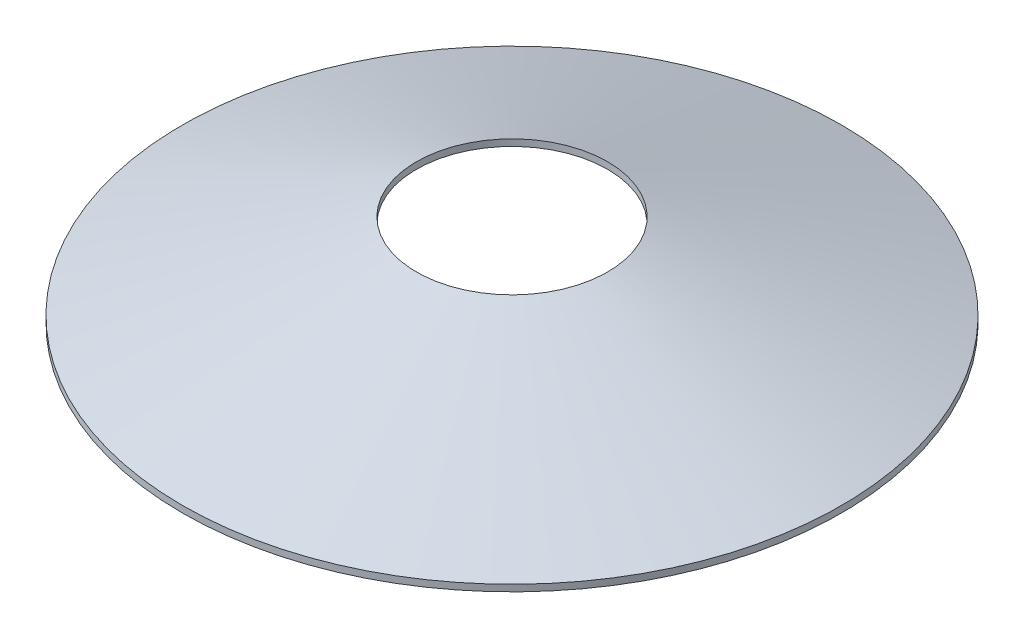
ISO-10303-21;
HEADER;
FILE_DESCRIPTION(('STEP AP214'),'2;1');
FILE_NAME('part.step','',(''),(''),'','','');
FILE_SCHEMA(('AUTOMOTIVE_DESIGN { 1 0 10303 214 1 1 1 1 }'));
ENDSEC;
DATA;
#1=APPLICATION_CONTEXT('core data for automotive mechanical design processes');
#2=APPLICATION_PROTOCOL_DEFINITION('international standard','automotive_design',2000,#1);
#3=PRODUCT_CONTEXT('',#1,'mechanical');
#4=PRODUCT('Part','Part','',(#3));
#5=PRODUCT_RELATED_PRODUCT_CATEGORY('part','',(#4));
#6=PRODUCT_DEFINITION_FORMATION('','',#4);
#7=PRODUCT_DEFINITION_CONTEXT('part definition',#1,'design');
#8=PRODUCT_DEFINITION('design','',#6,#7);
#9=PRODUCT_DEFINITION_SHAPE('','',#8);
#10=(LENGTH_UNIT() NAMED_UNIT(*) SI_UNIT(.MILLI.,.METRE.));
#11=(NAMED_UNIT(*) PLANE_ANGLE_UNIT() SI_UNIT($,.RADIAN.));
#12=(NAMED_UNIT(*) SI_UNIT($,.STERADIAN.) SOLID_ANGLE_UNIT());
#13=UNCERTAINTY_MEASURE_WITH_UNIT(LENGTH_MEASURE(1.E-05),#10,'distance_accuracy_value','');
#14=(GEOMETRIC_REPRESENTATION_CONTEXT(3) GLOBAL_UNCERTAINTY_ASSIGNED_CONTEXT((#13)) GLOBAL_UNIT_ASSIGNED_CONTEXT((#10,
#11,#12)) REPRESENTATION_CONTEXT('',''));
#15=CARTESIAN_POINT('',(0.,0.,0.));
#16=DIRECTION('',(0.,0.,1.));
#17=DIRECTION('',(1.,0.,0.));
#18=AXIS2_PLACEMENT_3D('',#15,#16,#17);
#19=CARTESIAN_POINT('',(0.,0.,0.));
#20=DIRECTION('',(0.,-1.,0.));
#21=DIRECTION('',(0.,0.,-1.));
#22=AXIS2_PLACEMENT_3D('',#19,#20,#21);
#23=CONICAL_SURFACE('',#22,17.5756774163615,1.22173047639603);
#24=CARTESIAN_POINT('',(0.,-4.15811336709957,0.));
#25=DIRECTION('',(0.,-1.,0.));
#26=DIRECTION('',(0.,0.,-1.));
#27=AXIS2_PLACEMENT_3D('',#24,#25,#26);
#28=CIRCLE('',#27,29.);
#29=CARTESIAN_POINT('',(0.,-4.15811336709956,-29.));
#30=VERTEX_POINT('',#29);
#31=EDGE_CURVE('E54',#30,#30,#28,.T.);
#32=CARTESIAN_POINT('',(0.,-30.,0.));
#33=DIRECTION('',(0.,-1.,0.));
#34=DIRECTION('',(0.,0.,-1.));
#35=AXIS2_PLACEMENT_3D('',#32,#33,#34);
#36=CIRCLE('',#35,100.);
#37=CARTESIAN_POINT('',(0.,-30.,-100.));
#38=VERTEX_POINT('',#37);
#39=EDGE_CURVE('E10',#38,#38,#36,.T.);
#40=CARTESIAN_POINT('',(0.,-4.15811336709956,-29.));
#41=CARTESIAN_POINT('',(0.,-4.42729968619228,-29.7395833333333));
#42=CARTESIAN_POINT('',(0.,-4.69648600528499,-30.4791666666667));
#43=CARTESIAN_POINT('',(0.,-5.23485864347042,-31.9583333333333));
#44=CARTESIAN_POINT('',(0.,-5.50404496256313,-32.6979166666667));
#45=CARTESIAN_POINT('',(0.,-6.04241760074855,-34.1770833333333));
#46=CARTESIAN_POINT('',(0.,-6.31160391984127,-34.9166666666667));
#47=CARTESIAN_POINT('',(0.,-6.84997655802669,-36.3958333333333));
#48=CARTESIAN_POINT('',(0.,-7.11916287711941,-37.1354166666667));
#49=CARTESIAN_POINT('',(0.,-7.65753551530483,-38.6145833333333));
#50=CARTESIAN_POINT('',(0.,-7.92672183439754,-39.3541666666667));
#51=CARTESIAN_POINT('',(0.,-8.46509447258297,-40.8333333333333));
#52=CARTESIAN_POINT('',(0.,-8.73428079167568,-41.5729166666667));
#53=CARTESIAN_POINT('',(0.,-9.27265342986111,-43.0520833333333));
#54=CARTESIAN_POINT('',(0.,-9.54183974895382,-43.7916666666667));
#55=CARTESIAN_POINT('',(0.,-10.0802123871392,-45.2708333333333));
#56=CARTESIAN_POINT('',(0.,-10.349398706232,-46.0104166666667));
#57=CARTESIAN_POINT('',(0.,-10.8877713444174,-47.4895833333333));
#58=CARTESIAN_POINT('',(0.,-11.1569576635101,-48.2291666666667));
#59=CARTESIAN_POINT('',(0.,-11.6953303016955,-49.7083333333333));
#60=CARTESIAN_POINT('',(0.,-11.9645166207882,-50.4479166666667));
#61=CARTESIAN_POINT('',(0.,-12.5028892589737,-51.9270833333333));
#62=CARTESIAN_POINT('',(0.,-12.7720755780664,-52.6666666666667));
#63=CARTESIAN_POINT('',(0.,-13.3104482162518,-54.1458333333333));
#64=CARTESIAN_POINT('',(0.,-13.5796345353445,-54.8854166666667));
#65=CARTESIAN_POINT('',(0.,-14.1180071735299,-56.3645833333333));
#66=CARTESIAN_POINT('',(0.,-14.3871934926227,-57.1041666666667));
#67=CARTESIAN_POINT('',(0.,-14.9255661308081,-58.5833333333333));
#68=CARTESIAN_POINT('',(0.,-15.1947524499008,-59.3229166666667));
#69=CARTESIAN_POINT('',(0.,-15.7331250880862,-60.8020833333333));
#70=CARTESIAN_POINT('',(0.,-16.0023114071789,-61.5416666666667));
#71=CARTESIAN_POINT('',(0.,-16.5406840453644,-63.0208333333333));
#72=CARTESIAN_POINT('',(0.,-16.8098703644571,-63.7604166666667));
#73=CARTESIAN_POINT('',(0.,-17.3482430026425,-65.2395833333333));
#74=CARTESIAN_POINT('',(0.,-17.6174293217352,-65.9791666666667));
#75=CARTESIAN_POINT('',(0.,-18.1558019599206,-67.4583333333333));
#76=CARTESIAN_POINT('',(0.,-18.4249882790133,-68.1979166666666));
#77=CARTESIAN_POINT('',(0.,-18.9633609171988,-69.6770833333333));
#78=CARTESIAN_POINT('',(0.,-19.2325472362915,-70.4166666666667));
#79=CARTESIAN_POINT('',(0.,-19.7709198744769,-71.8958333333333));
#80=CARTESIAN_POINT('',(0.,-20.0401061935696,-72.6354166666667));
#81=CARTESIAN_POINT('',(0.,-20.578478831755,-74.1145833333333));
#82=CARTESIAN_POINT('',(0.,-20.8476651508478,-74.8541666666667));
#83=CARTESIAN_POINT('',(0.,-21.3860377890332,-76.3333333333333));
#84=CARTESIAN_POINT('',(0.,-21.6552241081259,-77.0729166666667));
#85=CARTESIAN_POINT('',(0.,-22.1935967463113,-78.5520833333333));
#86=CARTESIAN_POINT('',(0.,-22.462783065404,-79.2916666666667));
#87=CARTESIAN_POINT('',(0.,-23.0011557035895,-80.7708333333333));
#88=CARTESIAN_POINT('',(0.,-23.2703420226822,-81.5104166666667));
#89=CARTESIAN_POINT('',(0.,-23.8087146608676,-82.9895833333333));
#90=CARTESIAN_POINT('',(0.,-24.0779009799603,-83.7291666666667));
#91=CARTESIAN_POINT('',(0.,-24.6162736181457,-85.2083333333333));
#92=CARTESIAN_POINT('',(0.,-24.8854599372384,-85.9479166666667));
#93=CARTESIAN_POINT('',(0.,-25.4238325754239,-87.4270833333333));
#94=CARTESIAN_POINT('',(0.,-25.6930188945166,-88.1666666666667));
#95=CARTESIAN_POINT('',(0.,-26.231391532702,-89.6458333333333));
#96=CARTESIAN_POINT('',(0.,-26.5005778517947,-90.3854166666667));
#97=CARTESIAN_POINT('',(0.,-27.0389504899802,-91.8645833333333));
#98=CARTESIAN_POINT('',(0.,-27.3081368090729,-92.6041666666667));
#99=CARTESIAN_POINT('',(0.,-27.8465094472583,-94.0833333333333));
#100=CARTESIAN_POINT('',(0.,-28.115695766351,-94.8229166666667));
#101=CARTESIAN_POINT('',(0.,-28.6540684045364,-96.3020833333333));
#102=CARTESIAN_POINT('',(0.,-28.9232547236291,-97.0416666666667));
#103=CARTESIAN_POINT('',(0.,-29.4616273618146,-98.5208333333333));
#104=CARTESIAN_POINT('',(0.,-29.7308136809073,-99.2604166666667));
#105=CARTESIAN_POINT('',(0.,-30.,-100.));
#106=B_SPLINE_CURVE_WITH_KNOTS('',3,(#40,#41,#42,#43,#44,#45,#46,#47,#48,#49,#50,#51,#52,#53,
#54,#55,#56,#57,#58,#59,#60,#61,#62,#63,#64,#65,#66,#67,#68,#69,#70,#71,#72,#73,#74,#75,#76,#77,
#78,#79,#80,#81,#82,#83,#84,#85,#86,#87,#88,#89,#90,#91,#92,#93,#94,#95,#96,#97,#98,#99,#100,
#101,#102,#103,#104,#105),.UNSPECIFIED.,.F.,.F.,(4,2,2,2,2,2,2,2,2,2,2,2,2,2,2,2,2,2,2,2,2,2,2,
2,2,2,2,2,2,2,2,2,4),(0.,2.36114443268093,4.72228886536186,7.0834332980428,9.44457773072372,
11.8057221634047,14.1668665960856,16.5280110287665,18.8891554614474,21.2502998941284,
23.6114443268093,25.9725887594902,28.3337331921712,30.6948776248521,33.056022057533,
35.4171664902139,37.7783109228949,40.1394553555758,42.5005997882567,44.8617442209377,
47.2228886536186,49.5840330862995,51.9451775189805,54.3063219516614,56.6674663843423,
59.0286108170233,61.3897552497042,63.7508996823851,66.1120441150661,68.473188547747,
70.8343329804279,73.1954774131089,75.5566218457898),.UNSPECIFIED.);
#107=EDGE_CURVE('BSEAM41',#30,#38,#106,.T.);
#108=ORIENTED_EDGE('',*,*,#31,.T.);
#109=ORIENTED_EDGE('',*,*,#39,.F.);
#110=ORIENTED_EDGE('',*,*,#107,.T.);
#111=ORIENTED_EDGE('',*,*,#107,.F.);
#112=EDGE_LOOP('',(#108,#110,#109,#111));
#113=FACE_BOUND('',#112,.T.);
#114=ADVANCED_FACE('F41',(#113),#23,.T.);
#115=CARTESIAN_POINT('',(0.,-2.,0.));
#116=DIRECTION('',(0.,-1.,0.));
#117=DIRECTION('',(0.,0.,-1.));
#118=AXIS2_PLACEMENT_3D('',#115,#116,#117);
#119=CYLINDRICAL_SURFACE('',#118,100.);
#120=CARTESIAN_POINT('',(0.,-32.,0.));
#121=DIRECTION('',(0.,-1.,0.));
#122=DIRECTION('',(0.,0.,-1.));
#123=AXIS2_PLACEMENT_3D('',#120,#121,#122);
#124=CIRCLE('',#123,100.);
#125=CARTESIAN_POINT('',(0.,-32.,-100.));
#126=VERTEX_POINT('',#125);
#127=EDGE_CURVE('E49',#126,#126,#124,.T.);
#128=ORIENTED_EDGE('',*,*,#127,.F.);
#129=EDGE_LOOP('',(#128));
#130=FACE_BOUND('',#129,.T.);
#131=ORIENTED_EDGE('',*,*,#39,.T.);
#132=EDGE_LOOP('',(#131));
#133=FACE_BOUND('',#132,.T.);
#134=ADVANCED_FACE('F75',(#130,#133),#119,.T.);
#135=CARTESIAN_POINT('',(0.,-32.,0.));
#136=DIRECTION('',(0.,-1.,0.));
#137=DIRECTION('',(0.,0.,-1.));
#138=AXIS2_PLACEMENT_3D('',#135,#136,#137);
#139=CONICAL_SURFACE('',#138,100.,1.22173047639603);
#140=CARTESIAN_POINT('',(0.,-6.15811336709958,0.));
#141=DIRECTION('',(0.,-1.,0.));
#142=DIRECTION('',(0.,0.,-1.));
#143=AXIS2_PLACEMENT_3D('',#140,#141,#142);
#144=CIRCLE('',#143,29.);
#145=CARTESIAN_POINT('',(0.,-6.15811336709958,-29.));
#146=VERTEX_POINT('',#145);
#147=EDGE_CURVE('E44',#146,#146,#144,.F.);
#148=CARTESIAN_POINT('',(0.,-6.15811336709958,-29.));
#149=CARTESIAN_POINT('',(0.,-6.42729968619229,-29.7395833333333));
#150=CARTESIAN_POINT('',(0.,-6.696486005285,-30.4791666666667));
#151=CARTESIAN_POINT('',(0.,-7.23485864347043,-31.9583333333333));
#152=CARTESIAN_POINT('',(0.,-7.50404496256314,-32.6979166666667));
#153=CARTESIAN_POINT('',(0.,-8.04241760074857,-34.1770833333333));
#154=CARTESIAN_POINT('',(0.,-8.31160391984128,-34.9166666666667));
#155=CARTESIAN_POINT('',(0.,-8.84997655802671,-36.3958333333333));
#156=CARTESIAN_POINT('',(0.,-9.11916287711942,-37.1354166666667));
#157=CARTESIAN_POINT('',(0.,-9.65753551530485,-38.6145833333333));
#158=CARTESIAN_POINT('',(0.,-9.92672183439756,-39.3541666666667));
#159=CARTESIAN_POINT('',(0.,-10.465094472583,-40.8333333333333));
#160=CARTESIAN_POINT('',(0.,-10.7342807916757,-41.5729166666667));
#161=CARTESIAN_POINT('',(0.,-11.2726534298611,-43.0520833333333));
#162=CARTESIAN_POINT('',(0.,-11.5418397489538,-43.7916666666667));
#163=CARTESIAN_POINT('',(0.,-12.0802123871393,-45.2708333333333));
#164=CARTESIAN_POINT('',(0.,-12.349398706232,-46.0104166666667));
#165=CARTESIAN_POINT('',(0.,-12.8877713444174,-47.4895833333333));
#166=CARTESIAN_POINT('',(0.,-13.1569576635101,-48.2291666666667));
#167=CARTESIAN_POINT('',(0.,-13.6953303016955,-49.7083333333333));
#168=CARTESIAN_POINT('',(0.,-13.9645166207883,-50.4479166666667));
#169=CARTESIAN_POINT('',(0.,-14.5028892589737,-51.9270833333333));
#170=CARTESIAN_POINT('',(0.,-14.7720755780664,-52.6666666666667));
#171=CARTESIAN_POINT('',(0.,-15.3104482162518,-54.1458333333333));
#172=CARTESIAN_POINT('',(0.,-15.5796345353445,-54.8854166666667));
#173=CARTESIAN_POINT('',(0.,-16.11800717353,-56.3645833333333));
#174=CARTESIAN_POINT('',(0.,-16.3871934926227,-57.1041666666667));
#175=CARTESIAN_POINT('',(0.,-16.9255661308081,-58.5833333333333));
#176=CARTESIAN_POINT('',(0.,-17.1947524499008,-59.3229166666667));
#177=CARTESIAN_POINT('',(0.,-17.7331250880862,-60.8020833333333));
#178=CARTESIAN_POINT('',(0.,-18.0023114071789,-61.5416666666667));
#179=CARTESIAN_POINT('',(0.,-18.5406840453644,-63.0208333333333));
#180=CARTESIAN_POINT('',(0.,-18.8098703644571,-63.7604166666667));
#181=CARTESIAN_POINT('',(0.,-19.3482430026425,-65.2395833333333));
#182=CARTESIAN_POINT('',(0.,-19.6174293217352,-65.9791666666667));
#183=CARTESIAN_POINT('',(0.,-20.1558019599206,-67.4583333333333));
#184=CARTESIAN_POINT('',(0.,-20.4249882790134,-68.1979166666666));
#185=CARTESIAN_POINT('',(0.,-20.9633609171988,-69.6770833333333));
#186=CARTESIAN_POINT('',(0.,-21.2325472362915,-70.4166666666667));
#187=CARTESIAN_POINT('',(0.,-21.7709198744769,-71.8958333333333));
#188=CARTESIAN_POINT('',(0.,-22.0401061935696,-72.6354166666667));
#189=CARTESIAN_POINT('',(0.,-22.5784788317551,-74.1145833333333));
#190=CARTESIAN_POINT('',(0.,-22.8476651508478,-74.8541666666667));
#191=CARTESIAN_POINT('',(0.,-23.3860377890332,-76.3333333333333));
#192=CARTESIAN_POINT('',(0.,-23.6552241081259,-77.0729166666667));
#193=CARTESIAN_POINT('',(0.,-24.1935967463113,-78.5520833333333));
#194=CARTESIAN_POINT('',(0.,-24.4627830654041,-79.2916666666667));
#195=CARTESIAN_POINT('',(0.,-25.0011557035895,-80.7708333333333));
#196=CARTESIAN_POINT('',(0.,-25.2703420226822,-81.5104166666667));
#197=CARTESIAN_POINT('',(0.,-25.8087146608676,-82.9895833333333));
#198=CARTESIAN_POINT('',(0.,-26.0779009799603,-83.7291666666667));
#199=CARTESIAN_POINT('',(0.,-26.6162736181458,-85.2083333333333));
#200=CARTESIAN_POINT('',(0.,-26.8854599372385,-85.9479166666667));
#201=CARTESIAN_POINT('',(0.,-27.4238325754239,-87.4270833333333));
#202=CARTESIAN_POINT('',(0.,-27.6930188945166,-88.1666666666667));
#203=CARTESIAN_POINT('',(0.,-28.231391532702,-89.6458333333333));
#204=CARTESIAN_POINT('',(0.,-28.5005778517947,-90.3854166666667));
#205=CARTESIAN_POINT('',(0.,-29.0389504899802,-91.8645833333333));
#206=CARTESIAN_POINT('',(0.,-29.3081368090729,-92.6041666666667));
#207=CARTESIAN_POINT('',(0.,-29.8465094472583,-94.0833333333333));
#208=CARTESIAN_POINT('',(0.,-30.115695766351,-94.8229166666667));
#209=CARTESIAN_POINT('',(0.,-30.6540684045364,-96.3020833333333));
#210=CARTESIAN_POINT('',(0.,-30.9232547236292,-97.0416666666667));
#211=CARTESIAN_POINT('',(0.,-31.4616273618146,-98.5208333333333));
#212=CARTESIAN_POINT('',(0.,-31.7308136809073,-99.2604166666667));
#213=CARTESIAN_POINT('',(0.,-32.,-100.));
#214=B_SPLINE_CURVE_WITH_KNOTS('',3,(#148,#149,#150,#151,#152,#153,#154,#155,#156,#157,#158,
#159,#160,#161,#162,#163,#164,#165,#166,#167,#168,#169,#170,#171,#172,#173,#174,#175,#176,#177,
#178,#179,#180,#181,#182,#183,#184,#185,#186,#187,#188,#189,#190,#191,#192,#193,#194,#195,#196,
#197,#198,#199,#200,#201,#202,#203,#204,#205,#206,#207,#208,#209,#210,#211,#212,#213),
.UNSPECIFIED.,.F.,.F.,(4,2,2,2,2,2,2,2,2,2,2,2,2,2,2,2,2,2,2,2,2,2,2,2,2,2,2,2,2,2,2,2,4),(0.,
2.36114443268094,4.72228886536186,7.08343329804279,9.44457773072373,11.8057221634047,
14.1668665960856,16.5280110287665,18.8891554614475,21.2502998941284,23.6114443268093,
25.9725887594902,28.3337331921712,30.6948776248521,33.056022057533,35.417166490214,
37.7783109228949,40.1394553555758,42.5005997882567,44.8617442209377,47.2228886536186,
49.5840330862995,51.9451775189805,54.3063219516614,56.6674663843423,59.0286108170233,
61.3897552497042,63.7508996823851,66.1120441150661,68.473188547747,70.8343329804279,
73.1954774131089,75.5566218457898),.UNSPECIFIED.);
#215=EDGE_CURVE('BSEAM65',#146,#126,#214,.T.);
#216=ORIENTED_EDGE('',*,*,#147,.T.);
#217=ORIENTED_EDGE('',*,*,#127,.T.);
#218=ORIENTED_EDGE('',*,*,#215,.T.);
#219=ORIENTED_EDGE('',*,*,#215,.F.);
#220=EDGE_LOOP('',(#216,#218,#217,#219));
#221=FACE_BOUND('',#220,.T.);
#222=ADVANCED_FACE('F65',(#221),#139,.F.);
#223=CARTESIAN_POINT('',(0.,-32.,0.));
#224=DIRECTION('',(0.,1.,0.));
#225=DIRECTION('',(0.,0.,1.));
#226=AXIS2_PLACEMENT_3D('',#223,#224,#225);
#227=CYLINDRICAL_SURFACE('',#226,29.);
#228=ORIENTED_EDGE('',*,*,#147,.F.);
#229=EDGE_LOOP('',(#228));
#230=FACE_BOUND('',#229,.T.);
#231=ORIENTED_EDGE('',*,*,#31,.F.);
#232=EDGE_LOOP('',(#231));
#233=FACE_BOUND('',#232,.T.);
#234=ADVANCED_FACE('F68',(#230,#233),#227,.F.);
#235=CLOSED_SHELL('',(#114,#134,#222,#234));
#236=MANIFOLD_SOLID_BREP('B2',#235);
#237=ADVANCED_BREP_SHAPE_REPRESENTATION('',(#18,#236),#14);
#238=SHAPE_DEFINITION_REPRESENTATION(#9,#237);
ENDSEC;
END-ISO-10303-21;
